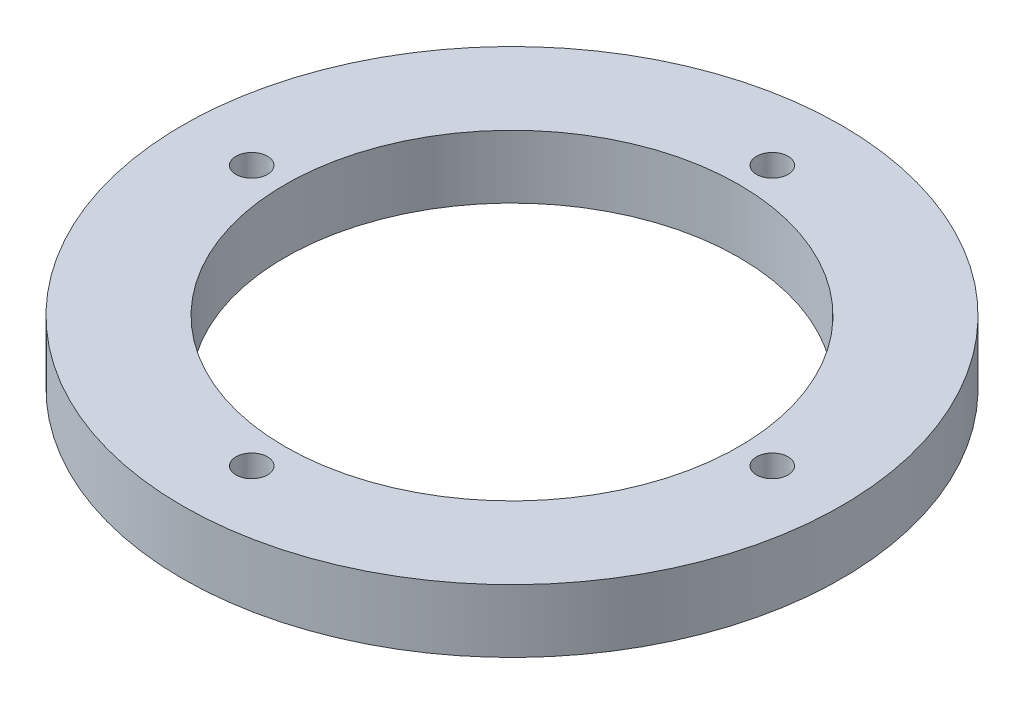
ISO-10303-21;
HEADER;
FILE_DESCRIPTION(('STEP AP214'),'2;1');
FILE_NAME('part.step','',(''),(''),'','','');
FILE_SCHEMA(('AUTOMOTIVE_DESIGN { 1 0 10303 214 1 1 1 1 }'));
ENDSEC;
DATA;
#1=APPLICATION_CONTEXT('core data for automotive mechanical design processes');
#2=APPLICATION_PROTOCOL_DEFINITION('international standard','automotive_design',2000,#1);
#3=PRODUCT_CONTEXT('',#1,'mechanical');
#4=PRODUCT('Part','Part','',(#3));
#5=PRODUCT_RELATED_PRODUCT_CATEGORY('part','',(#4));
#6=PRODUCT_DEFINITION_FORMATION('','',#4);
#7=PRODUCT_DEFINITION_CONTEXT('part definition',#1,'design');
#8=PRODUCT_DEFINITION('design','',#6,#7);
#9=PRODUCT_DEFINITION_SHAPE('','',#8);
#10=(LENGTH_UNIT() NAMED_UNIT(*) SI_UNIT(.MILLI.,.METRE.));
#11=(NAMED_UNIT(*) PLANE_ANGLE_UNIT() SI_UNIT($,.RADIAN.));
#12=(NAMED_UNIT(*) SI_UNIT($,.STERADIAN.) SOLID_ANGLE_UNIT());
#13=UNCERTAINTY_MEASURE_WITH_UNIT(LENGTH_MEASURE(1.E-05),#10,'distance_accuracy_value','');
#14=(GEOMETRIC_REPRESENTATION_CONTEXT(3) GLOBAL_UNCERTAINTY_ASSIGNED_CONTEXT((#13)) GLOBAL_UNIT_ASSIGNED_CONTEXT((#10,
#11,#12)) REPRESENTATION_CONTEXT('',''));
#15=CARTESIAN_POINT('',(0.,0.,0.));
#16=DIRECTION('',(0.,0.,1.));
#17=DIRECTION('',(1.,0.,0.));
#18=AXIS2_PLACEMENT_3D('',#15,#16,#17);
#19=CARTESIAN_POINT('',(0.,5.,0.));
#20=DIRECTION('',(0.,1.,0.));
#21=DIRECTION('',(0.,0.,1.));
#22=AXIS2_PLACEMENT_3D('',#19,#20,#21);
#23=PLANE('',#22);
#24=CARTESIAN_POINT('',(20.64,5.,0.));
#25=DIRECTION('',(0.,1.,0.));
#26=DIRECTION('',(0.,0.,1.));
#27=AXIS2_PLACEMENT_3D('',#24,#25,#26);
#28=CIRCLE('',#27,1.25);
#29=CARTESIAN_POINT('',(20.64,5.,1.25));
#30=VERTEX_POINT('',#29);
#31=EDGE_CURVE('E59',#30,#30,#28,.T.);
#32=ORIENTED_EDGE('',*,*,#31,.F.);
#33=EDGE_LOOP('',(#32));
#34=FACE_BOUND('',#33,.T.);
#35=CARTESIAN_POINT('',(-20.64,5.,0.));
#36=DIRECTION('',(0.,1.,0.));
#37=DIRECTION('',(0.,0.,1.));
#38=AXIS2_PLACEMENT_3D('',#35,#36,#37);
#39=CIRCLE('',#38,1.25);
#40=CARTESIAN_POINT('',(-20.64,5.,1.25));
#41=VERTEX_POINT('',#40);
#42=EDGE_CURVE('E47',#41,#41,#39,.T.);
#43=ORIENTED_EDGE('',*,*,#42,.F.);
#44=EDGE_LOOP('',(#43));
#45=FACE_BOUND('',#44,.T.);
#46=CARTESIAN_POINT('',(0.,5.,0.));
#47=DIRECTION('',(0.,1.,0.));
#48=DIRECTION('',(0.,0.,1.));
#49=AXIS2_PLACEMENT_3D('',#46,#47,#48);
#50=CIRCLE('',#49,26.1324452665351);
#51=CARTESIAN_POINT('',(0.,5.,26.1324452665351));
#52=VERTEX_POINT('',#51);
#53=EDGE_CURVE('E10',#52,#52,#50,.T.);
#54=ORIENTED_EDGE('',*,*,#53,.T.);
#55=EDGE_LOOP('',(#54));
#56=FACE_BOUND('',#55,.T.);
#57=CARTESIAN_POINT('',(0.,5.,-20.64));
#58=DIRECTION('',(0.,1.,0.));
#59=DIRECTION('',(0.,0.,1.));
#60=AXIS2_PLACEMENT_3D('',#57,#58,#59);
#61=CIRCLE('',#60,1.25);
#62=CARTESIAN_POINT('',(0.,5.,-19.39));
#63=VERTEX_POINT('',#62);
#64=EDGE_CURVE('E42',#63,#63,#61,.T.);
#65=ORIENTED_EDGE('',*,*,#64,.F.);
#66=EDGE_LOOP('',(#65));
#67=FACE_BOUND('',#66,.T.);
#68=CARTESIAN_POINT('',(0.,5.,20.64));
#69=DIRECTION('',(0.,1.,0.));
#70=DIRECTION('',(0.,0.,1.));
#71=AXIS2_PLACEMENT_3D('',#68,#69,#70);
#72=CIRCLE('',#71,1.25);
#73=CARTESIAN_POINT('',(0.,5.,21.89));
#74=VERTEX_POINT('',#73);
#75=EDGE_CURVE('E53',#74,#74,#72,.T.);
#76=ORIENTED_EDGE('',*,*,#75,.F.);
#77=EDGE_LOOP('',(#76));
#78=FACE_BOUND('',#77,.T.);
#79=CARTESIAN_POINT('',(0.,5.,0.));
#80=DIRECTION('',(0.,1.,0.));
#81=DIRECTION('',(0.,0.,1.));
#82=AXIS2_PLACEMENT_3D('',#79,#80,#81);
#83=CIRCLE('',#82,18.);
#84=CARTESIAN_POINT('',(0.,5.,18.));
#85=VERTEX_POINT('',#84);
#86=EDGE_CURVE('E65',#85,#85,#83,.T.);
#87=ORIENTED_EDGE('',*,*,#86,.F.);
#88=EDGE_LOOP('',(#87));
#89=FACE_BOUND('',#88,.T.);
#90=ADVANCED_FACE('F31',(#34,#45,#56,#67,#78,#89),#23,.T.);
#91=CARTESIAN_POINT('',(0.,0.,0.));
#92=DIRECTION('',(0.,1.,0.));
#93=DIRECTION('',(0.,0.,1.));
#94=AXIS2_PLACEMENT_3D('',#91,#92,#93);
#95=PLANE('',#94);
#96=CARTESIAN_POINT('',(0.,0.,0.));
#97=DIRECTION('',(0.,1.,0.));
#98=DIRECTION('',(0.,0.,1.));
#99=AXIS2_PLACEMENT_3D('',#96,#97,#98);
#100=CIRCLE('',#99,26.1324452665351);
#101=CARTESIAN_POINT('',(0.,0.,26.1324452665351));
#102=VERTEX_POINT('',#101);
#103=EDGE_CURVE('E35',#102,#102,#100,.T.);
#104=ORIENTED_EDGE('',*,*,#103,.F.);
#105=EDGE_LOOP('',(#104));
#106=FACE_BOUND('',#105,.T.);
#107=CARTESIAN_POINT('',(0.,0.,-20.64));
#108=DIRECTION('',(0.,1.,0.));
#109=DIRECTION('',(0.,0.,1.));
#110=AXIS2_PLACEMENT_3D('',#107,#108,#109);
#111=CIRCLE('',#110,1.25);
#112=CARTESIAN_POINT('',(0.,0.,-19.39));
#113=VERTEX_POINT('',#112);
#114=EDGE_CURVE('E44',#113,#113,#111,.T.);
#115=ORIENTED_EDGE('',*,*,#114,.T.);
#116=EDGE_LOOP('',(#115));
#117=FACE_BOUND('',#116,.T.);
#118=CARTESIAN_POINT('',(-20.64,0.,0.));
#119=DIRECTION('',(0.,1.,0.));
#120=DIRECTION('',(0.,0.,1.));
#121=AXIS2_PLACEMENT_3D('',#118,#119,#120);
#122=CIRCLE('',#121,1.25);
#123=CARTESIAN_POINT('',(-20.64,0.,1.25));
#124=VERTEX_POINT('',#123);
#125=EDGE_CURVE('E50',#124,#124,#122,.T.);
#126=ORIENTED_EDGE('',*,*,#125,.T.);
#127=EDGE_LOOP('',(#126));
#128=FACE_BOUND('',#127,.T.);
#129=CARTESIAN_POINT('',(0.,0.,20.64));
#130=DIRECTION('',(0.,1.,0.));
#131=DIRECTION('',(0.,0.,1.));
#132=AXIS2_PLACEMENT_3D('',#129,#130,#131);
#133=CIRCLE('',#132,1.25);
#134=CARTESIAN_POINT('',(0.,0.,21.89));
#135=VERTEX_POINT('',#134);
#136=EDGE_CURVE('E56',#135,#135,#133,.T.);
#137=ORIENTED_EDGE('',*,*,#136,.T.);
#138=EDGE_LOOP('',(#137));
#139=FACE_BOUND('',#138,.T.);
#140=CARTESIAN_POINT('',(20.64,0.,0.));
#141=DIRECTION('',(0.,1.,0.));
#142=DIRECTION('',(0.,0.,1.));
#143=AXIS2_PLACEMENT_3D('',#140,#141,#142);
#144=CIRCLE('',#143,1.25);
#145=CARTESIAN_POINT('',(20.64,0.,1.25));
#146=VERTEX_POINT('',#145);
#147=EDGE_CURVE('E62',#146,#146,#144,.T.);
#148=ORIENTED_EDGE('',*,*,#147,.T.);
#149=EDGE_LOOP('',(#148));
#150=FACE_BOUND('',#149,.T.);
#151=CARTESIAN_POINT('',(0.,0.,0.));
#152=DIRECTION('',(0.,1.,0.));
#153=DIRECTION('',(0.,0.,1.));
#154=AXIS2_PLACEMENT_3D('',#151,#152,#153);
#155=CIRCLE('',#154,18.);
#156=CARTESIAN_POINT('',(0.,0.,18.));
#157=VERTEX_POINT('',#156);
#158=EDGE_CURVE('E68',#157,#157,#155,.T.);
#159=ORIENTED_EDGE('',*,*,#158,.T.);
#160=EDGE_LOOP('',(#159));
#161=FACE_BOUND('',#160,.T.);
#162=ADVANCED_FACE('F78',(#106,#117,#128,#139,#150,#161),#95,.F.);
#163=CARTESIAN_POINT('',(0.,5.,0.));
#164=DIRECTION('',(0.,-1.,0.));
#165=DIRECTION('',(0.,0.,-1.));
#166=AXIS2_PLACEMENT_3D('',#163,#164,#165);
#167=CYLINDRICAL_SURFACE('',#166,26.1324452665351);
#168=ORIENTED_EDGE('',*,*,#53,.F.);
#169=EDGE_LOOP('',(#168));
#170=FACE_BOUND('',#169,.T.);
#171=ORIENTED_EDGE('',*,*,#103,.T.);
#172=EDGE_LOOP('',(#171));
#173=FACE_BOUND('',#172,.T.);
#174=ADVANCED_FACE('F33',(#170,#173),#167,.T.);
#175=CARTESIAN_POINT('',(0.,5.,-20.64));
#176=DIRECTION('',(0.,-1.,0.));
#177=DIRECTION('',(0.,0.,-1.));
#178=AXIS2_PLACEMENT_3D('',#175,#176,#177);
#179=CYLINDRICAL_SURFACE('',#178,1.25);
#180=ORIENTED_EDGE('',*,*,#64,.T.);
#181=EDGE_LOOP('',(#180));
#182=FACE_BOUND('',#181,.T.);
#183=ORIENTED_EDGE('',*,*,#114,.F.);
#184=EDGE_LOOP('',(#183));
#185=FACE_BOUND('',#184,.T.);
#186=ADVANCED_FACE('F88',(#182,#185),#179,.F.);
#187=CARTESIAN_POINT('',(-20.64,5.,0.));
#188=DIRECTION('',(0.,-1.,0.));
#189=DIRECTION('',(0.,0.,-1.));
#190=AXIS2_PLACEMENT_3D('',#187,#188,#189);
#191=CYLINDRICAL_SURFACE('',#190,1.25);
#192=ORIENTED_EDGE('',*,*,#42,.T.);
#193=EDGE_LOOP('',(#192));
#194=FACE_BOUND('',#193,.T.);
#195=ORIENTED_EDGE('',*,*,#125,.F.);
#196=EDGE_LOOP('',(#195));
#197=FACE_BOUND('',#196,.T.);
#198=ADVANCED_FACE('F91',(#194,#197),#191,.F.);
#199=CARTESIAN_POINT('',(0.,5.,20.64));
#200=DIRECTION('',(0.,-1.,0.));
#201=DIRECTION('',(0.,0.,-1.));
#202=AXIS2_PLACEMENT_3D('',#199,#200,#201);
#203=CYLINDRICAL_SURFACE('',#202,1.25);
#204=ORIENTED_EDGE('',*,*,#75,.T.);
#205=EDGE_LOOP('',(#204));
#206=FACE_BOUND('',#205,.T.);
#207=ORIENTED_EDGE('',*,*,#136,.F.);
#208=EDGE_LOOP('',(#207));
#209=FACE_BOUND('',#208,.T.);
#210=ADVANCED_FACE('F95',(#206,#209),#203,.F.);
#211=CARTESIAN_POINT('',(20.64,5.,0.));
#212=DIRECTION('',(0.,-1.,0.));
#213=DIRECTION('',(0.,0.,-1.));
#214=AXIS2_PLACEMENT_3D('',#211,#212,#213);
#215=CYLINDRICAL_SURFACE('',#214,1.25);
#216=ORIENTED_EDGE('',*,*,#31,.T.);
#217=EDGE_LOOP('',(#216));
#218=FACE_BOUND('',#217,.T.);
#219=ORIENTED_EDGE('',*,*,#147,.F.);
#220=EDGE_LOOP('',(#219));
#221=FACE_BOUND('',#220,.T.);
#222=ADVANCED_FACE('F99',(#218,#221),#215,.F.);
#223=CARTESIAN_POINT('',(0.,5.,0.));
#224=DIRECTION('',(0.,-1.,0.));
#225=DIRECTION('',(0.,0.,-1.));
#226=AXIS2_PLACEMENT_3D('',#223,#224,#225);
#227=CYLINDRICAL_SURFACE('',#226,18.);
#228=ORIENTED_EDGE('',*,*,#86,.T.);
#229=EDGE_LOOP('',(#228));
#230=FACE_BOUND('',#229,.T.);
#231=ORIENTED_EDGE('',*,*,#158,.F.);
#232=EDGE_LOOP('',(#231));
#233=FACE_BOUND('',#232,.T.);
#234=ADVANCED_FACE('F74',(#230,#233),#227,.F.);
#235=CLOSED_SHELL('',(#90,#162,#174,#186,#198,#210,#222,#234));
#236=MANIFOLD_SOLID_BREP('B2',#235);
#237=ADVANCED_BREP_SHAPE_REPRESENTATION('',(#18,#236),#14);
#238=SHAPE_DEFINITION_REPRESENTATION(#9,#237);
ENDSEC;
END-ISO-10303-21;
